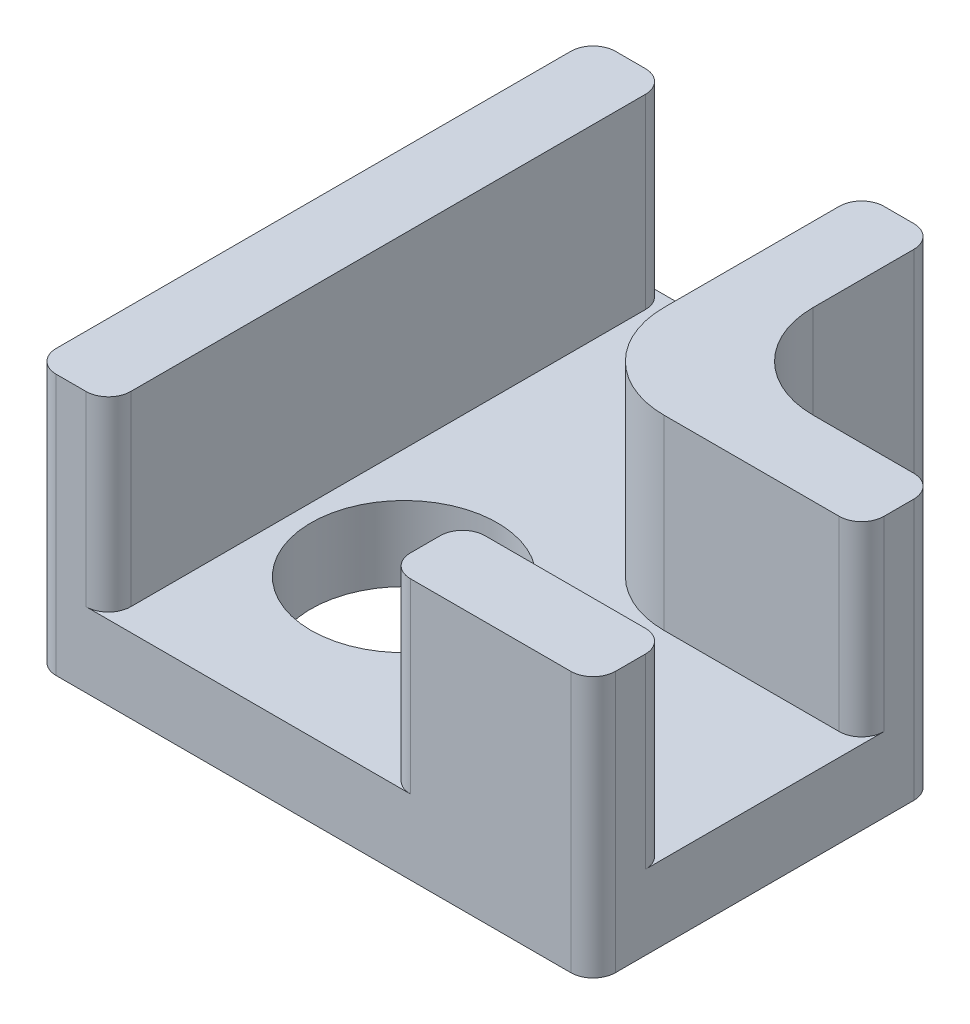
ISO-10303-21;
HEADER;
FILE_DESCRIPTION(('STEP AP214'),'2;1');
FILE_NAME('part.step','',(''),(''),'','','');
FILE_SCHEMA(('AUTOMOTIVE_DESIGN { 1 0 10303 214 1 1 1 1 }'));
ENDSEC;
DATA;
#1=APPLICATION_CONTEXT('core data for automotive mechanical design processes');
#2=APPLICATION_PROTOCOL_DEFINITION('international standard','automotive_design',2000,#1);
#3=PRODUCT_CONTEXT('',#1,'mechanical');
#4=PRODUCT('Part','Part','',(#3));
#5=PRODUCT_RELATED_PRODUCT_CATEGORY('part','',(#4));
#6=PRODUCT_DEFINITION_FORMATION('','',#4);
#7=PRODUCT_DEFINITION_CONTEXT('part definition',#1,'design');
#8=PRODUCT_DEFINITION('design','',#6,#7);
#9=PRODUCT_DEFINITION_SHAPE('','',#8);
#10=(LENGTH_UNIT() NAMED_UNIT(*) SI_UNIT(.MILLI.,.METRE.));
#11=(NAMED_UNIT(*) PLANE_ANGLE_UNIT() SI_UNIT($,.RADIAN.));
#12=(NAMED_UNIT(*) SI_UNIT($,.STERADIAN.) SOLID_ANGLE_UNIT());
#13=UNCERTAINTY_MEASURE_WITH_UNIT(LENGTH_MEASURE(1.E-05),#10,'distance_accuracy_value','');
#14=(GEOMETRIC_REPRESENTATION_CONTEXT(3) GLOBAL_UNCERTAINTY_ASSIGNED_CONTEXT((#13)) GLOBAL_UNIT_ASSIGNED_CONTEXT((#10,
#11,#12)) REPRESENTATION_CONTEXT('',''));
#15=CARTESIAN_POINT('',(0.,0.,0.));
#16=DIRECTION('',(0.,0.,1.));
#17=DIRECTION('',(1.,0.,0.));
#18=AXIS2_PLACEMENT_3D('',#15,#16,#17);
#19=CARTESIAN_POINT('',(30.,30.9,0.));
#20=DIRECTION('',(-1.,0.,0.));
#21=DIRECTION('',(0.,0.,1.));
#22=AXIS2_PLACEMENT_3D('',#19,#20,#21);
#23=PLANE('',#22);
#24=DIRECTION('',(0.,0.,-1.));
#25=VECTOR('',#24,1.);
#26=CARTESIAN_POINT('',(30.,0.,0.));
#27=LINE('',#26,#25);
#28=CARTESIAN_POINT('',(30.,0.,-1.2));
#29=VERTEX_POINT('',#28);
#30=CARTESIAN_POINT('',(30.,0.,-17.2));
#31=VERTEX_POINT('',#30);
#32=EDGE_CURVE('E433',#29,#31,#27,.T.);
#33=ORIENTED_EDGE('',*,*,#32,.T.);
#34=DIRECTION('',(0.,-1.,0.));
#35=VECTOR('',#34,1.);
#36=CARTESIAN_POINT('',(30.,30.9,-17.2));
#37=LINE('',#36,#35);
#38=CARTESIAN_POINT('',(30.,14.,-17.2));
#39=VERTEX_POINT('',#38);
#40=EDGE_CURVE('E336',#31,#39,#37,.F.);
#41=ORIENTED_EDGE('',*,*,#40,.T.);
#42=DIRECTION('',(0.,0.,1.));
#43=VECTOR('',#42,1.);
#44=CARTESIAN_POINT('',(30.,14.,0.));
#45=LINE('',#44,#43);
#46=CARTESIAN_POINT('',(30.,14.,-15.6));
#47=VERTEX_POINT('',#46);
#48=EDGE_CURVE('E476',#39,#47,#45,.T.);
#49=ORIENTED_EDGE('',*,*,#48,.T.);
#50=DIRECTION('',(0.,-1.,0.));
#51=VECTOR('',#50,1.);
#52=CARTESIAN_POINT('',(30.,4.,-15.6));
#53=LINE('',#52,#51);
#54=CARTESIAN_POINT('',(30.,4.,-15.6));
#55=VERTEX_POINT('',#54);
#56=EDGE_CURVE('E330',#47,#55,#53,.T.);
#57=ORIENTED_EDGE('',*,*,#56,.T.);
#58=DIRECTION('',(0.,0.,-1.));
#59=VECTOR('',#58,1.);
#60=CARTESIAN_POINT('',(30.,4.,0.));
#61=LINE('',#60,#59);
#62=CARTESIAN_POINT('',(30.,4.,-2.8));
#63=VERTEX_POINT('',#62);
#64=EDGE_CURVE('E421',#63,#55,#61,.T.);
#65=ORIENTED_EDGE('',*,*,#64,.F.);
#66=DIRECTION('',(0.,-1.,0.));
#67=VECTOR('',#66,1.);
#68=CARTESIAN_POINT('',(30.,14.,-2.8));
#69=LINE('',#68,#67);
#70=CARTESIAN_POINT('',(30.,14.,-2.8));
#71=VERTEX_POINT('',#70);
#72=EDGE_CURVE('E328',#63,#71,#69,.F.);
#73=ORIENTED_EDGE('',*,*,#72,.T.);
#74=CARTESIAN_POINT('',(30.,14.,-1.2));
#75=VERTEX_POINT('',#74);
#76=EDGE_CURVE('E469',#71,#75,#45,.T.);
#77=ORIENTED_EDGE('',*,*,#76,.T.);
#78=DIRECTION('',(0.,-1.,0.));
#79=VECTOR('',#78,1.);
#80=CARTESIAN_POINT('',(30.,30.9,-1.2));
#81=LINE('',#80,#79);
#82=EDGE_CURVE('E333',#75,#29,#81,.T.);
#83=ORIENTED_EDGE('',*,*,#82,.T.);
#84=EDGE_LOOP('',(#33,#41,#49,#57,#65,#73,#77,#83));
#85=FACE_BOUND('',#84,.T.);
#86=ADVANCED_FACE('F42',(#85),#23,.F.);
#87=CARTESIAN_POINT('',(18.4,30.9,-30.));
#88=DIRECTION('',(0.,0.,1.));
#89=DIRECTION('',(1.,0.,0.));
#90=AXIS2_PLACEMENT_3D('',#87,#88,#89);
#91=PLANE('',#90);
#92=DIRECTION('',(-1.,0.,0.));
#93=VECTOR('',#92,1.);
#94=CARTESIAN_POINT('',(18.4,0.,-30.));
#95=LINE('',#94,#93);
#96=CARTESIAN_POINT('',(17.2,0.,-30.));
#97=VERTEX_POINT('',#96);
#98=CARTESIAN_POINT('',(1.2,0.,-30.));
#99=VERTEX_POINT('',#98);
#100=EDGE_CURVE('E260',#97,#99,#95,.T.);
#101=ORIENTED_EDGE('',*,*,#100,.T.);
#102=DIRECTION('',(0.,-1.,0.));
#103=VECTOR('',#102,1.);
#104=CARTESIAN_POINT('',(1.2,30.9,-30.));
#105=LINE('',#104,#103);
#106=CARTESIAN_POINT('',(1.2,14.,-30.));
#107=VERTEX_POINT('',#106);
#108=EDGE_CURVE('E314',#99,#107,#105,.F.);
#109=ORIENTED_EDGE('',*,*,#108,.T.);
#110=DIRECTION('',(1.,0.,0.));
#111=VECTOR('',#110,1.);
#112=CARTESIAN_POINT('',(18.4,14.,-30.));
#113=LINE('',#112,#111);
#114=CARTESIAN_POINT('',(2.8,14.,-30.));
#115=VERTEX_POINT('',#114);
#116=EDGE_CURVE('E392',#107,#115,#113,.T.);
#117=ORIENTED_EDGE('',*,*,#116,.T.);
#118=DIRECTION('',(0.,-1.,0.));
#119=VECTOR('',#118,1.);
#120=CARTESIAN_POINT('',(2.8,4.,-30.));
#121=LINE('',#120,#119);
#122=CARTESIAN_POINT('',(2.8,4.,-30.));
#123=VERTEX_POINT('',#122);
#124=EDGE_CURVE('E308',#115,#123,#121,.T.);
#125=ORIENTED_EDGE('',*,*,#124,.T.);
#126=DIRECTION('',(-1.,0.,0.));
#127=VECTOR('',#126,1.);
#128=CARTESIAN_POINT('',(18.4,4.,-30.));
#129=LINE('',#128,#127);
#130=CARTESIAN_POINT('',(15.6,4.,-30.));
#131=VERTEX_POINT('',#130);
#132=EDGE_CURVE('E378',#131,#123,#129,.T.);
#133=ORIENTED_EDGE('',*,*,#132,.F.);
#134=DIRECTION('',(0.,-1.,0.));
#135=VECTOR('',#134,1.);
#136=CARTESIAN_POINT('',(15.6,14.,-30.));
#137=LINE('',#136,#135);
#138=CARTESIAN_POINT('',(15.6,14.,-30.));
#139=VERTEX_POINT('',#138);
#140=EDGE_CURVE('E306',#131,#139,#137,.F.);
#141=ORIENTED_EDGE('',*,*,#140,.T.);
#142=CARTESIAN_POINT('',(17.2,14.,-30.));
#143=VERTEX_POINT('',#142);
#144=EDGE_CURVE('E239',#139,#143,#113,.T.);
#145=ORIENTED_EDGE('',*,*,#144,.T.);
#146=DIRECTION('',(0.,-1.,0.));
#147=VECTOR('',#146,1.);
#148=CARTESIAN_POINT('',(17.2,30.9,-30.));
#149=LINE('',#148,#147);
#150=EDGE_CURVE('E311',#143,#97,#149,.T.);
#151=ORIENTED_EDGE('',*,*,#150,.T.);
#152=EDGE_LOOP('',(#101,#109,#117,#125,#133,#141,#145,#151));
#153=FACE_BOUND('',#152,.T.);
#154=ADVANCED_FACE('F388',(#153),#91,.F.);
#155=CARTESIAN_POINT('',(0.,30.9,-30.));
#156=DIRECTION('',(1.,0.,0.));
#157=DIRECTION('',(0.,0.,-1.));
#158=AXIS2_PLACEMENT_3D('',#155,#156,#157);
#159=PLANE('',#158);
#160=DIRECTION('',(0.,0.,1.));
#161=VECTOR('',#160,1.);
#162=CARTESIAN_POINT('',(0.,0.,-30.));
#163=LINE('',#162,#161);
#164=CARTESIAN_POINT('',(0.,0.,-28.8));
#165=VERTEX_POINT('',#164);
#166=CARTESIAN_POINT('',(0.,0.,-1.2));
#167=VERTEX_POINT('',#166);
#168=EDGE_CURVE('E426',#165,#167,#163,.T.);
#169=ORIENTED_EDGE('',*,*,#168,.T.);
#170=DIRECTION('',(0.,-1.,0.));
#171=VECTOR('',#170,1.);
#172=CARTESIAN_POINT('',(0.,30.9,-1.2));
#173=LINE('',#172,#171);
#174=CARTESIAN_POINT('',(0.,14.,-1.2));
#175=VERTEX_POINT('',#174);
#176=EDGE_CURVE('E296',#167,#175,#173,.F.);
#177=ORIENTED_EDGE('',*,*,#176,.T.);
#178=DIRECTION('',(0.,0.,-1.));
#179=VECTOR('',#178,1.);
#180=CARTESIAN_POINT('',(0.,14.,-30.));
#181=LINE('',#180,#179);
#182=CARTESIAN_POINT('',(0.,14.,-28.8));
#183=VERTEX_POINT('',#182);
#184=EDGE_CURVE('E395',#175,#183,#181,.T.);
#185=ORIENTED_EDGE('',*,*,#184,.T.);
#186=DIRECTION('',(0.,-1.,0.));
#187=VECTOR('',#186,1.);
#188=CARTESIAN_POINT('',(0.,30.9,-28.8));
#189=LINE('',#188,#187);
#190=EDGE_CURVE('E293',#183,#165,#189,.T.);
#191=ORIENTED_EDGE('',*,*,#190,.T.);
#192=EDGE_LOOP('',(#169,#177,#185,#191));
#193=FACE_BOUND('',#192,.T.);
#194=ADVANCED_FACE('F452',(#193),#159,.F.);
#195=CARTESIAN_POINT('',(0.,30.9,0.));
#196=DIRECTION('',(0.,0.,-1.));
#197=DIRECTION('',(-1.,0.,0.));
#198=AXIS2_PLACEMENT_3D('',#195,#196,#197);
#199=PLANE('',#198);
#200=DIRECTION('',(-1.,0.,0.));
#201=VECTOR('',#200,1.);
#202=CARTESIAN_POINT('',(0.,14.,0.));
#203=LINE('',#202,#201);
#204=CARTESIAN_POINT('',(2.8,14.,0.));
#205=VERTEX_POINT('',#204);
#206=CARTESIAN_POINT('',(1.2,14.,0.));
#207=VERTEX_POINT('',#206);
#208=EDGE_CURVE('E460',#205,#207,#203,.T.);
#209=ORIENTED_EDGE('',*,*,#208,.T.);
#210=DIRECTION('',(0.,-1.,0.));
#211=VECTOR('',#210,1.);
#212=CARTESIAN_POINT('',(1.2,30.9,0.));
#213=LINE('',#212,#211);
#214=CARTESIAN_POINT('',(1.2,0.,0.));
#215=VERTEX_POINT('',#214);
#216=EDGE_CURVE('E280',#207,#215,#213,.T.);
#217=ORIENTED_EDGE('',*,*,#216,.T.);
#218=DIRECTION('',(1.,0.,0.));
#219=VECTOR('',#218,1.);
#220=CARTESIAN_POINT('',(0.,0.,0.));
#221=LINE('',#220,#219);
#222=CARTESIAN_POINT('',(28.8,0.,0.));
#223=VERTEX_POINT('',#222);
#224=EDGE_CURVE('E430',#215,#223,#221,.T.);
#225=ORIENTED_EDGE('',*,*,#224,.T.);
#226=DIRECTION('',(0.,-1.,0.));
#227=VECTOR('',#226,1.);
#228=CARTESIAN_POINT('',(28.8,30.9,0.));
#229=LINE('',#228,#227);
#230=CARTESIAN_POINT('',(28.8,14.,0.));
#231=VERTEX_POINT('',#230);
#232=EDGE_CURVE('E278',#223,#231,#229,.F.);
#233=ORIENTED_EDGE('',*,*,#232,.T.);
#234=CARTESIAN_POINT('',(20.2,14.,0.));
#235=VERTEX_POINT('',#234);
#236=EDGE_CURVE('E465',#231,#235,#203,.T.);
#237=ORIENTED_EDGE('',*,*,#236,.T.);
#238=DIRECTION('',(0.,1.,0.));
#239=VECTOR('',#238,1.);
#240=CARTESIAN_POINT('',(20.2,30.9,0.));
#241=LINE('',#240,#239);
#242=CARTESIAN_POINT('',(20.2,4.,0.));
#243=VERTEX_POINT('',#242);
#244=EDGE_CURVE('E275',#235,#243,#241,.F.);
#245=ORIENTED_EDGE('',*,*,#244,.T.);
#246=DIRECTION('',(1.,0.,0.));
#247=VECTOR('',#246,1.);
#248=CARTESIAN_POINT('',(4.,4.,0.));
#249=LINE('',#248,#247);
#250=CARTESIAN_POINT('',(2.8,4.,0.));
#251=VERTEX_POINT('',#250);
#252=EDGE_CURVE('E411',#251,#243,#249,.T.);
#253=ORIENTED_EDGE('',*,*,#252,.F.);
#254=DIRECTION('',(0.,-1.,0.));
#255=VECTOR('',#254,1.);
#256=CARTESIAN_POINT('',(2.8,14.,0.));
#257=LINE('',#256,#255);
#258=EDGE_CURVE('E273',#251,#205,#257,.F.);
#259=ORIENTED_EDGE('',*,*,#258,.T.);
#260=EDGE_LOOP('',(#209,#217,#225,#233,#237,#245,#253,#259));
#261=FACE_BOUND('',#260,.T.);
#262=ADVANCED_FACE('F463',(#261),#199,.F.);
#263=CARTESIAN_POINT('',(30.,30.9,-18.4));
#264=DIRECTION('',(0.,0.,1.));
#265=DIRECTION('',(1.,0.,0.));
#266=AXIS2_PLACEMENT_3D('',#263,#264,#265);
#267=PLANE('',#266);
#268=DIRECTION('',(1.,0.,0.));
#269=VECTOR('',#268,1.);
#270=CARTESIAN_POINT('',(30.,14.,-18.4));
#271=LINE('',#270,#269);
#272=CARTESIAN_POINT('',(23.4,14.,-18.4));
#273=VERTEX_POINT('',#272);
#274=CARTESIAN_POINT('',(28.8,14.,-18.4));
#275=VERTEX_POINT('',#274);
#276=EDGE_CURVE('E240',#273,#275,#271,.T.);
#277=ORIENTED_EDGE('',*,*,#276,.T.);
#278=DIRECTION('',(0.,-1.,0.));
#279=VECTOR('',#278,1.);
#280=CARTESIAN_POINT('',(28.8,30.9,-18.4));
#281=LINE('',#280,#279);
#282=CARTESIAN_POINT('',(28.8,0.,-18.4));
#283=VERTEX_POINT('',#282);
#284=EDGE_CURVE('E325',#275,#283,#281,.T.);
#285=ORIENTED_EDGE('',*,*,#284,.T.);
#286=DIRECTION('',(-1.,0.,0.));
#287=VECTOR('',#286,1.);
#288=CARTESIAN_POINT('',(30.,0.,-18.4));
#289=LINE('',#288,#287);
#290=CARTESIAN_POINT('',(23.4,0.,-18.4));
#291=VERTEX_POINT('',#290);
#292=EDGE_CURVE('E436',#283,#291,#289,.T.);
#293=ORIENTED_EDGE('',*,*,#292,.T.);
#294=DIRECTION('',(0.,-1.,0.));
#295=VECTOR('',#294,1.);
#296=CARTESIAN_POINT('',(23.4,14.,-18.4));
#297=LINE('',#296,#295);
#298=EDGE_CURVE('E254',#291,#273,#297,.F.);
#299=ORIENTED_EDGE('',*,*,#298,.T.);
#300=EDGE_LOOP('',(#277,#285,#293,#299));
#301=FACE_BOUND('',#300,.T.);
#302=ADVANCED_FACE('F523',(#301),#267,.F.);
#303=CARTESIAN_POINT('',(18.4,30.9,-18.4));
#304=DIRECTION('',(-1.,0.,0.));
#305=DIRECTION('',(0.,0.,1.));
#306=AXIS2_PLACEMENT_3D('',#303,#304,#305);
#307=PLANE('',#306);
#308=DIRECTION('',(0.,0.,-1.));
#309=VECTOR('',#308,1.);
#310=CARTESIAN_POINT('',(18.4,0.,-18.4));
#311=LINE('',#310,#309);
#312=CARTESIAN_POINT('',(18.4,0.,-23.4));
#313=VERTEX_POINT('',#312);
#314=CARTESIAN_POINT('',(18.4,0.,-28.8));
#315=VERTEX_POINT('',#314);
#316=EDGE_CURVE('E438',#313,#315,#311,.T.);
#317=ORIENTED_EDGE('',*,*,#316,.T.);
#318=DIRECTION('',(0.,-1.,0.));
#319=VECTOR('',#318,1.);
#320=CARTESIAN_POINT('',(18.4,30.9,-28.8));
#321=LINE('',#320,#319);
#322=CARTESIAN_POINT('',(18.4,14.,-28.8));
#323=VERTEX_POINT('',#322);
#324=EDGE_CURVE('E236',#315,#323,#321,.F.);
#325=ORIENTED_EDGE('',*,*,#324,.T.);
#326=DIRECTION('',(0.,0.,1.));
#327=VECTOR('',#326,1.);
#328=CARTESIAN_POINT('',(18.4,14.,-18.4));
#329=LINE('',#328,#327);
#330=CARTESIAN_POINT('',(18.4,14.,-23.4));
#331=VERTEX_POINT('',#330);
#332=EDGE_CURVE('E228',#323,#331,#329,.T.);
#333=ORIENTED_EDGE('',*,*,#332,.T.);
#334=DIRECTION('',(0.,-1.,0.));
#335=VECTOR('',#334,1.);
#336=CARTESIAN_POINT('',(18.4,0.,-23.4));
#337=LINE('',#336,#335);
#338=EDGE_CURVE('E233',#331,#313,#337,.T.);
#339=ORIENTED_EDGE('',*,*,#338,.T.);
#340=EDGE_LOOP('',(#317,#325,#333,#339));
#341=FACE_BOUND('',#340,.T.);
#342=ADVANCED_FACE('F231',(#341),#307,.F.);
#343=CARTESIAN_POINT('',(4.,30.9,-30.));
#344=DIRECTION('',(1.,0.,0.));
#345=DIRECTION('',(0.,0.,-1.));
#346=AXIS2_PLACEMENT_3D('',#343,#344,#345);
#347=PLANE('',#346);
#348=DIRECTION('',(0.,0.,1.));
#349=VECTOR('',#348,1.);
#350=CARTESIAN_POINT('',(4.,4.,-30.));
#351=LINE('',#350,#349);
#352=CARTESIAN_POINT('',(4.,4.,-28.8));
#353=VERTEX_POINT('',#352);
#354=CARTESIAN_POINT('',(4.,4.,-1.2));
#355=VERTEX_POINT('',#354);
#356=EDGE_CURVE('E413',#353,#355,#351,.T.);
#357=ORIENTED_EDGE('',*,*,#356,.F.);
#358=DIRECTION('',(0.,-1.,0.));
#359=VECTOR('',#358,1.);
#360=CARTESIAN_POINT('',(4.,14.,-28.8));
#361=LINE('',#360,#359);
#362=CARTESIAN_POINT('',(4.,14.,-28.8));
#363=VERTEX_POINT('',#362);
#364=EDGE_CURVE('E361',#353,#363,#361,.F.);
#365=ORIENTED_EDGE('',*,*,#364,.T.);
#366=DIRECTION('',(0.,0.,1.));
#367=VECTOR('',#366,1.);
#368=CARTESIAN_POINT('',(4.,14.,-30.));
#369=LINE('',#368,#367);
#370=CARTESIAN_POINT('',(4.,14.,-1.2));
#371=VERTEX_POINT('',#370);
#372=EDGE_CURVE('E407',#363,#371,#369,.T.);
#373=ORIENTED_EDGE('',*,*,#372,.T.);
#374=DIRECTION('',(0.,-1.,0.));
#375=VECTOR('',#374,1.);
#376=CARTESIAN_POINT('',(4.,4.,-1.2));
#377=LINE('',#376,#375);
#378=EDGE_CURVE('E359',#371,#355,#377,.T.);
#379=ORIENTED_EDGE('',*,*,#378,.T.);
#380=EDGE_LOOP('',(#357,#365,#373,#379));
#381=FACE_BOUND('',#380,.T.);
#382=ADVANCED_FACE('F580',(#381),#347,.T.);
#383=CARTESIAN_POINT('',(0.,30.9,-4.));
#384=DIRECTION('',(0.,0.,-1.));
#385=DIRECTION('',(-1.,0.,0.));
#386=AXIS2_PLACEMENT_3D('',#383,#384,#385);
#387=PLANE('',#386);
#388=DIRECTION('',(1.,0.,0.));
#389=VECTOR('',#388,1.);
#390=CARTESIAN_POINT('',(0.,14.,-4.));
#391=LINE('',#390,#389);
#392=CARTESIAN_POINT('',(20.2,14.,-4.));
#393=VERTEX_POINT('',#392);
#394=CARTESIAN_POINT('',(28.8,14.,-4.));
#395=VERTEX_POINT('',#394);
#396=EDGE_CURVE('E400',#393,#395,#391,.T.);
#397=ORIENTED_EDGE('',*,*,#396,.T.);
#398=DIRECTION('',(0.,-1.,0.));
#399=VECTOR('',#398,1.);
#400=CARTESIAN_POINT('',(28.8,4.,-4.));
#401=LINE('',#400,#399);
#402=CARTESIAN_POINT('',(28.8,4.,-4.));
#403=VERTEX_POINT('',#402);
#404=EDGE_CURVE('E351',#395,#403,#401,.T.);
#405=ORIENTED_EDGE('',*,*,#404,.T.);
#406=DIRECTION('',(1.,0.,0.));
#407=VECTOR('',#406,1.);
#408=CARTESIAN_POINT('',(0.,4.,-4.));
#409=LINE('',#408,#407);
#410=CARTESIAN_POINT('',(20.2,4.,-4.));
#411=VERTEX_POINT('',#410);
#412=EDGE_CURVE('E418',#411,#403,#409,.T.);
#413=ORIENTED_EDGE('',*,*,#412,.F.);
#414=DIRECTION('',(0.,1.,0.));
#415=VECTOR('',#414,1.);
#416=CARTESIAN_POINT('',(20.2,14.,-4.));
#417=LINE('',#416,#415);
#418=EDGE_CURVE('E348',#411,#393,#417,.T.);
#419=ORIENTED_EDGE('',*,*,#418,.T.);
#420=EDGE_LOOP('',(#397,#405,#413,#419));
#421=FACE_BOUND('',#420,.T.);
#422=ADVANCED_FACE('F512',(#421),#387,.T.);
#423=CARTESIAN_POINT('',(30.,30.9,-14.4));
#424=DIRECTION('',(0.,0.,1.));
#425=DIRECTION('',(1.,0.,0.));
#426=AXIS2_PLACEMENT_3D('',#423,#424,#425);
#427=PLANE('',#426);
#428=DIRECTION('',(-1.,0.,0.));
#429=VECTOR('',#428,1.);
#430=CARTESIAN_POINT('',(30.,4.,-14.4));
#431=LINE('',#430,#429);
#432=CARTESIAN_POINT('',(28.8,4.,-14.4));
#433=VERTEX_POINT('',#432);
#434=CARTESIAN_POINT('',(19.4,4.,-14.4));
#435=VERTEX_POINT('',#434);
#436=EDGE_CURVE('E422',#433,#435,#431,.T.);
#437=ORIENTED_EDGE('',*,*,#436,.F.);
#438=DIRECTION('',(0.,-1.,0.));
#439=VECTOR('',#438,1.);
#440=CARTESIAN_POINT('',(28.8,14.,-14.4));
#441=LINE('',#440,#439);
#442=CARTESIAN_POINT('',(28.8,14.,-14.4));
#443=VERTEX_POINT('',#442);
#444=EDGE_CURVE('E346',#433,#443,#441,.F.);
#445=ORIENTED_EDGE('',*,*,#444,.T.);
#446=DIRECTION('',(-1.,0.,0.));
#447=VECTOR('',#446,1.);
#448=CARTESIAN_POINT('',(30.,14.,-14.4));
#449=LINE('',#448,#447);
#450=CARTESIAN_POINT('',(19.4,14.,-14.4));
#451=VERTEX_POINT('',#450);
#452=EDGE_CURVE('E405',#443,#451,#449,.T.);
#453=ORIENTED_EDGE('',*,*,#452,.T.);
#454=DIRECTION('',(0.,-1.,0.));
#455=VECTOR('',#454,1.);
#456=CARTESIAN_POINT('',(19.4,30.9,-14.4));
#457=LINE('',#456,#455);
#458=EDGE_CURVE('E257',#451,#435,#457,.T.);
#459=ORIENTED_EDGE('',*,*,#458,.T.);
#460=EDGE_LOOP('',(#437,#445,#453,#459));
#461=FACE_BOUND('',#460,.T.);
#462=ADVANCED_FACE('F493',(#461),#427,.T.);
#463=CARTESIAN_POINT('',(14.4,30.9,-18.4));
#464=DIRECTION('',(-1.,0.,0.));
#465=DIRECTION('',(0.,0.,1.));
#466=AXIS2_PLACEMENT_3D('',#463,#464,#465);
#467=PLANE('',#466);
#468=DIRECTION('',(0.,0.,-1.));
#469=VECTOR('',#468,1.);
#470=CARTESIAN_POINT('',(14.4,14.,-18.4));
#471=LINE('',#470,#469);
#472=CARTESIAN_POINT('',(14.4,14.,-19.4));
#473=VERTEX_POINT('',#472);
#474=CARTESIAN_POINT('',(14.4,14.,-28.8));
#475=VERTEX_POINT('',#474);
#476=EDGE_CURVE('E403',#473,#475,#471,.T.);
#477=ORIENTED_EDGE('',*,*,#476,.T.);
#478=DIRECTION('',(0.,-1.,0.));
#479=VECTOR('',#478,1.);
#480=CARTESIAN_POINT('',(14.4,4.,-28.8));
#481=LINE('',#480,#479);
#482=CARTESIAN_POINT('',(14.4,4.,-28.8));
#483=VERTEX_POINT('',#482);
#484=EDGE_CURVE('E363',#475,#483,#481,.T.);
#485=ORIENTED_EDGE('',*,*,#484,.T.);
#486=DIRECTION('',(0.,0.,-1.));
#487=VECTOR('',#486,1.);
#488=CARTESIAN_POINT('',(14.4,4.,-18.4));
#489=LINE('',#488,#487);
#490=CARTESIAN_POINT('',(14.4,4.,-19.4));
#491=VERTEX_POINT('',#490);
#492=EDGE_CURVE('E381',#491,#483,#489,.T.);
#493=ORIENTED_EDGE('',*,*,#492,.F.);
#494=DIRECTION('',(0.,-1.,0.));
#495=VECTOR('',#494,1.);
#496=CARTESIAN_POINT('',(14.4,30.9,-19.4));
#497=LINE('',#496,#495);
#498=EDGE_CURVE('E266',#491,#473,#497,.F.);
#499=ORIENTED_EDGE('',*,*,#498,.T.);
#500=EDGE_LOOP('',(#477,#485,#493,#499));
#501=FACE_BOUND('',#500,.T.);
#502=ADVANCED_FACE('F501',(#501),#467,.T.);
#503=CARTESIAN_POINT('',(19.,26.9,-30.001));
#504=DIRECTION('',(1.,0.,0.));
#505=DIRECTION('',(0.,1.,0.));
#506=AXIS2_PLACEMENT_3D('',#503,#504,#505);
#507=PLANE('',#506);
#508=DIRECTION('',(0.,0.,1.));
#509=VECTOR('',#508,1.);
#510=CARTESIAN_POINT('',(19.,14.,-30.001));
#511=LINE('',#510,#509);
#512=CARTESIAN_POINT('',(19.,14.,-2.8));
#513=VERTEX_POINT('',#512);
#514=CARTESIAN_POINT('',(19.,14.,-1.2));
#515=VERTEX_POINT('',#514);
#516=EDGE_CURVE('E255',#513,#515,#511,.T.);
#517=ORIENTED_EDGE('',*,*,#516,.F.);
#518=DIRECTION('',(0.,1.,0.));
#519=VECTOR('',#518,1.);
#520=CARTESIAN_POINT('',(19.,4.,-2.8));
#521=LINE('',#520,#519);
#522=CARTESIAN_POINT('',(19.,4.,-2.8));
#523=VERTEX_POINT('',#522);
#524=EDGE_CURVE('E357',#513,#523,#521,.F.);
#525=ORIENTED_EDGE('',*,*,#524,.T.);
#526=DIRECTION('',(0.,0.,1.));
#527=VECTOR('',#526,1.);
#528=CARTESIAN_POINT('',(19.,4.,-30.001));
#529=LINE('',#528,#527);
#530=CARTESIAN_POINT('',(19.,4.,-1.2));
#531=VERTEX_POINT('',#530);
#532=EDGE_CURVE('E410',#523,#531,#529,.T.);
#533=ORIENTED_EDGE('',*,*,#532,.T.);
#534=DIRECTION('',(0.,1.,0.));
#535=VECTOR('',#534,1.);
#536=CARTESIAN_POINT('',(19.,26.9,-1.2));
#537=LINE('',#536,#535);
#538=EDGE_CURVE('E354',#531,#515,#537,.T.);
#539=ORIENTED_EDGE('',*,*,#538,.T.);
#540=EDGE_LOOP('',(#517,#525,#533,#539));
#541=FACE_BOUND('',#540,.T.);
#542=ADVANCED_FACE('F503',(#541),#507,.F.);
#543=CARTESIAN_POINT('',(0.,0.,0.));
#544=DIRECTION('',(0.,1.,0.));
#545=DIRECTION('',(0.,0.,1.));
#546=AXIS2_PLACEMENT_3D('',#543,#544,#545);
#547=PLANE('',#546);
#548=CARTESIAN_POINT('',(9.93223304703363,0.,-9.93223304703363));
#549=DIRECTION('',(0.,1.,0.));
#550=DIRECTION('',(0.,0.,1.));
#551=AXIS2_PLACEMENT_3D('',#548,#549,#550);
#552=CIRCLE('',#551,5.);
#553=CARTESIAN_POINT('',(9.93223304703363,0.,-4.93223304703363));
#554=VERTEX_POINT('',#553);
#555=EDGE_CURVE('E466',#554,#554,#552,.T.);
#556=ORIENTED_EDGE('',*,*,#555,.T.);
#557=EDGE_LOOP('',(#556));
#558=FACE_BOUND('',#557,.T.);
#559=ORIENTED_EDGE('',*,*,#224,.F.);
#560=CARTESIAN_POINT('',(1.2,0.,-1.2));
#561=DIRECTION('',(0.,1.,0.));
#562=DIRECTION('',(0.,0.,1.));
#563=AXIS2_PLACEMENT_3D('',#560,#561,#562);
#564=CIRCLE('',#563,1.2);
#565=EDGE_CURVE('E291',#215,#167,#564,.F.);
#566=ORIENTED_EDGE('',*,*,#565,.T.);
#567=ORIENTED_EDGE('',*,*,#168,.F.);
#568=CARTESIAN_POINT('',(1.2,0.,-28.8));
#569=DIRECTION('',(0.,1.,0.));
#570=DIRECTION('',(0.,0.,1.));
#571=AXIS2_PLACEMENT_3D('',#568,#569,#570);
#572=CIRCLE('',#571,1.2);
#573=EDGE_CURVE('E289',#165,#99,#572,.F.);
#574=ORIENTED_EDGE('',*,*,#573,.T.);
#575=ORIENTED_EDGE('',*,*,#100,.F.);
#576=CARTESIAN_POINT('',(17.2,0.,-28.8));
#577=DIRECTION('',(0.,1.,0.));
#578=DIRECTION('',(0.,0.,1.));
#579=AXIS2_PLACEMENT_3D('',#576,#577,#578);
#580=CIRCLE('',#579,1.2);
#581=EDGE_CURVE('E287',#97,#315,#580,.F.);
#582=ORIENTED_EDGE('',*,*,#581,.T.);
#583=ORIENTED_EDGE('',*,*,#316,.F.);
#584=CARTESIAN_POINT('',(23.4,0.,-23.4));
#585=DIRECTION('',(0.,1.,0.));
#586=DIRECTION('',(0.,0.,1.));
#587=AXIS2_PLACEMENT_3D('',#584,#585,#586);
#588=CIRCLE('',#587,5.);
#589=EDGE_CURVE('E250',#313,#291,#588,.T.);
#590=ORIENTED_EDGE('',*,*,#589,.T.);
#591=ORIENTED_EDGE('',*,*,#292,.F.);
#592=CARTESIAN_POINT('',(28.8,0.,-17.2));
#593=DIRECTION('',(0.,1.,0.));
#594=DIRECTION('',(0.,0.,1.));
#595=AXIS2_PLACEMENT_3D('',#592,#593,#594);
#596=CIRCLE('',#595,1.2);
#597=EDGE_CURVE('E285',#283,#31,#596,.F.);
#598=ORIENTED_EDGE('',*,*,#597,.T.);
#599=ORIENTED_EDGE('',*,*,#32,.F.);
#600=CARTESIAN_POINT('',(28.8,0.,-1.2));
#601=DIRECTION('',(0.,1.,0.));
#602=DIRECTION('',(0.,0.,1.));
#603=AXIS2_PLACEMENT_3D('',#600,#601,#602);
#604=CIRCLE('',#603,1.2);
#605=EDGE_CURVE('E283',#29,#223,#604,.F.);
#606=ORIENTED_EDGE('',*,*,#605,.T.);
#607=EDGE_LOOP('',(#559,#566,#567,#574,#575,#582,#583,#590,#591,#598,#599,#606));
#608=FACE_BOUND('',#607,.T.);
#609=ADVANCED_FACE('F509',(#558,#608),#547,.F.);
#610=CARTESIAN_POINT('',(0.,4.,0.));
#611=DIRECTION('',(0.,1.,0.));
#612=DIRECTION('',(0.,0.,1.));
#613=AXIS2_PLACEMENT_3D('',#610,#611,#612);
#614=PLANE('',#613);
#615=CARTESIAN_POINT('',(9.93223304703363,4.,-9.93223304703363));
#616=DIRECTION('',(0.,1.,0.));
#617=DIRECTION('',(0.,0.,1.));
#618=AXIS2_PLACEMENT_3D('',#615,#616,#617);
#619=CIRCLE('',#618,5.);
#620=CARTESIAN_POINT('',(9.93223304703363,4.,-4.93223304703363));
#621=VERTEX_POINT('',#620);
#622=EDGE_CURVE('E471',#621,#621,#619,.T.);
#623=ORIENTED_EDGE('',*,*,#622,.F.);
#624=EDGE_LOOP('',(#623));
#625=FACE_BOUND('',#624,.T.);
#626=ORIENTED_EDGE('',*,*,#132,.T.);
#627=CARTESIAN_POINT('',(2.8,4.,-28.8));
#628=DIRECTION('',(0.,1.,0.));
#629=DIRECTION('',(0.,0.,1.));
#630=AXIS2_PLACEMENT_3D('',#627,#628,#629);
#631=CIRCLE('',#630,1.2);
#632=EDGE_CURVE('E374',#123,#353,#631,.F.);
#633=ORIENTED_EDGE('',*,*,#632,.T.);
#634=ORIENTED_EDGE('',*,*,#356,.T.);
#635=CARTESIAN_POINT('',(2.8,4.,-1.2));
#636=DIRECTION('',(0.,1.,0.));
#637=DIRECTION('',(0.,0.,1.));
#638=AXIS2_PLACEMENT_3D('',#635,#636,#637);
#639=CIRCLE('',#638,1.2);
#640=EDGE_CURVE('E13',#355,#251,#639,.F.);
#641=ORIENTED_EDGE('',*,*,#640,.T.);
#642=ORIENTED_EDGE('',*,*,#252,.T.);
#643=CARTESIAN_POINT('',(20.2,4.,-1.2));
#644=DIRECTION('',(0.,1.,0.));
#645=DIRECTION('',(0.,0.,1.));
#646=AXIS2_PLACEMENT_3D('',#643,#644,#645);
#647=CIRCLE('',#646,1.2);
#648=EDGE_CURVE('E372',#243,#531,#647,.F.);
#649=ORIENTED_EDGE('',*,*,#648,.T.);
#650=ORIENTED_EDGE('',*,*,#532,.F.);
#651=CARTESIAN_POINT('',(20.2,4.,-2.8));
#652=DIRECTION('',(0.,1.,0.));
#653=DIRECTION('',(0.,0.,1.));
#654=AXIS2_PLACEMENT_3D('',#651,#652,#653);
#655=CIRCLE('',#654,1.2);
#656=EDGE_CURVE('E370',#523,#411,#655,.F.);
#657=ORIENTED_EDGE('',*,*,#656,.T.);
#658=ORIENTED_EDGE('',*,*,#412,.T.);
#659=CARTESIAN_POINT('',(28.8,4.,-2.8));
#660=DIRECTION('',(0.,1.,0.));
#661=DIRECTION('',(0.,0.,1.));
#662=AXIS2_PLACEMENT_3D('',#659,#660,#661);
#663=CIRCLE('',#662,1.2);
#664=EDGE_CURVE('E367',#403,#63,#663,.F.);
#665=ORIENTED_EDGE('',*,*,#664,.T.);
#666=ORIENTED_EDGE('',*,*,#64,.T.);
#667=CARTESIAN_POINT('',(28.8,4.,-15.6));
#668=DIRECTION('',(0.,1.,0.));
#669=DIRECTION('',(0.,0.,1.));
#670=AXIS2_PLACEMENT_3D('',#667,#668,#669);
#671=CIRCLE('',#670,1.2);
#672=EDGE_CURVE('E365',#55,#433,#671,.F.);
#673=ORIENTED_EDGE('',*,*,#672,.T.);
#674=ORIENTED_EDGE('',*,*,#436,.T.);
#675=CARTESIAN_POINT('',(19.4,4.,-19.4));
#676=DIRECTION('',(0.,1.,0.));
#677=DIRECTION('',(0.,0.,1.));
#678=AXIS2_PLACEMENT_3D('',#675,#676,#677);
#679=CIRCLE('',#678,5.);
#680=EDGE_CURVE('E249',#435,#491,#679,.F.);
#681=ORIENTED_EDGE('',*,*,#680,.T.);
#682=ORIENTED_EDGE('',*,*,#492,.T.);
#683=CARTESIAN_POINT('',(15.6,4.,-28.8));
#684=DIRECTION('',(0.,1.,0.));
#685=DIRECTION('',(0.,0.,1.));
#686=AXIS2_PLACEMENT_3D('',#683,#684,#685);
#687=CIRCLE('',#686,1.2);
#688=EDGE_CURVE('E50',#483,#131,#687,.F.);
#689=ORIENTED_EDGE('',*,*,#688,.T.);
#690=EDGE_LOOP('',(#626,#633,#634,#641,#642,#649,#650,#657,#658,#665,#666,#673,#674,#681,#682,#689));
#691=FACE_BOUND('',#690,.T.);
#692=ADVANCED_FACE('F377',(#625,#691),#614,.T.);
#693=CARTESIAN_POINT('',(0.,14.,0.));
#694=DIRECTION('',(0.,1.,0.));
#695=DIRECTION('',(0.,0.,1.));
#696=AXIS2_PLACEMENT_3D('',#693,#694,#695);
#697=PLANE('',#696);
#698=ORIENTED_EDGE('',*,*,#236,.F.);
#699=CARTESIAN_POINT('',(28.8,14.,-1.2));
#700=DIRECTION('',(0.,1.,0.));
#701=DIRECTION('',(0.,0.,1.));
#702=AXIS2_PLACEMENT_3D('',#699,#700,#701);
#703=CIRCLE('',#702,1.2);
#704=EDGE_CURVE('E344',#231,#75,#703,.T.);
#705=ORIENTED_EDGE('',*,*,#704,.T.);
#706=ORIENTED_EDGE('',*,*,#76,.F.);
#707=CARTESIAN_POINT('',(28.8,14.,-2.8));
#708=DIRECTION('',(0.,1.,0.));
#709=DIRECTION('',(0.,0.,1.));
#710=AXIS2_PLACEMENT_3D('',#707,#708,#709);
#711=CIRCLE('',#710,1.2);
#712=EDGE_CURVE('E342',#71,#395,#711,.T.);
#713=ORIENTED_EDGE('',*,*,#712,.T.);
#714=ORIENTED_EDGE('',*,*,#396,.F.);
#715=CARTESIAN_POINT('',(20.2,14.,-2.8));
#716=DIRECTION('',(0.,1.,0.));
#717=DIRECTION('',(0.,0.,1.));
#718=AXIS2_PLACEMENT_3D('',#715,#716,#717);
#719=CIRCLE('',#718,1.2);
#720=EDGE_CURVE('E340',#393,#513,#719,.T.);
#721=ORIENTED_EDGE('',*,*,#720,.T.);
#722=ORIENTED_EDGE('',*,*,#516,.T.);
#723=CARTESIAN_POINT('',(20.2,14.,-1.2));
#724=DIRECTION('',(0.,1.,0.));
#725=DIRECTION('',(0.,0.,1.));
#726=AXIS2_PLACEMENT_3D('',#723,#724,#725);
#727=CIRCLE('',#726,1.2);
#728=EDGE_CURVE('E338',#515,#235,#727,.T.);
#729=ORIENTED_EDGE('',*,*,#728,.T.);
#730=EDGE_LOOP('',(#698,#705,#706,#713,#714,#721,#722,#729));
#731=FACE_BOUND('',#730,.T.);
#732=ADVANCED_FACE('F591',(#731),#697,.T.);
#733=ORIENTED_EDGE('',*,*,#332,.F.);
#734=CARTESIAN_POINT('',(17.2,14.,-28.8));
#735=DIRECTION('',(0.,1.,0.));
#736=DIRECTION('',(0.,0.,1.));
#737=AXIS2_PLACEMENT_3D('',#734,#735,#736);
#738=CIRCLE('',#737,1.2);
#739=EDGE_CURVE('E323',#323,#143,#738,.T.);
#740=ORIENTED_EDGE('',*,*,#739,.T.);
#741=ORIENTED_EDGE('',*,*,#144,.F.);
#742=CARTESIAN_POINT('',(15.6,14.,-28.8));
#743=DIRECTION('',(0.,1.,0.));
#744=DIRECTION('',(0.,0.,1.));
#745=AXIS2_PLACEMENT_3D('',#742,#743,#744);
#746=CIRCLE('',#745,1.2);
#747=EDGE_CURVE('E317',#139,#475,#746,.T.);
#748=ORIENTED_EDGE('',*,*,#747,.T.);
#749=ORIENTED_EDGE('',*,*,#476,.F.);
#750=CARTESIAN_POINT('',(19.4,14.,-19.4));
#751=DIRECTION('',(0.,1.,0.));
#752=DIRECTION('',(0.,0.,1.));
#753=AXIS2_PLACEMENT_3D('',#750,#751,#752);
#754=CIRCLE('',#753,5.);
#755=EDGE_CURVE('E268',#473,#451,#754,.T.);
#756=ORIENTED_EDGE('',*,*,#755,.T.);
#757=ORIENTED_EDGE('',*,*,#452,.F.);
#758=CARTESIAN_POINT('',(28.8,14.,-15.6));
#759=DIRECTION('',(0.,1.,0.));
#760=DIRECTION('',(0.,0.,1.));
#761=AXIS2_PLACEMENT_3D('',#758,#759,#760);
#762=CIRCLE('',#761,1.2);
#763=EDGE_CURVE('E319',#443,#47,#762,.T.);
#764=ORIENTED_EDGE('',*,*,#763,.T.);
#765=ORIENTED_EDGE('',*,*,#48,.F.);
#766=CARTESIAN_POINT('',(28.8,14.,-17.2));
#767=DIRECTION('',(0.,1.,0.));
#768=DIRECTION('',(0.,0.,1.));
#769=AXIS2_PLACEMENT_3D('',#766,#767,#768);
#770=CIRCLE('',#769,1.2);
#771=EDGE_CURVE('E321',#39,#275,#770,.T.);
#772=ORIENTED_EDGE('',*,*,#771,.T.);
#773=ORIENTED_EDGE('',*,*,#276,.F.);
#774=CARTESIAN_POINT('',(23.4,14.,-23.4));
#775=DIRECTION('',(0.,1.,0.));
#776=DIRECTION('',(0.,0.,1.));
#777=AXIS2_PLACEMENT_3D('',#774,#775,#776);
#778=CIRCLE('',#777,5.);
#779=EDGE_CURVE('E244',#273,#331,#778,.F.);
#780=ORIENTED_EDGE('',*,*,#779,.T.);
#781=EDGE_LOOP('',(#733,#740,#741,#748,#749,#756,#757,#764,#765,#772,#773,#780));
#782=FACE_BOUND('',#781,.T.);
#783=ADVANCED_FACE('F245',(#782),#697,.T.);
#784=ORIENTED_EDGE('',*,*,#184,.F.);
#785=CARTESIAN_POINT('',(1.2,14.,-1.2));
#786=DIRECTION('',(0.,1.,0.));
#787=DIRECTION('',(0.,0.,1.));
#788=AXIS2_PLACEMENT_3D('',#785,#786,#787);
#789=CIRCLE('',#788,1.2);
#790=EDGE_CURVE('E304',#175,#207,#789,.T.);
#791=ORIENTED_EDGE('',*,*,#790,.T.);
#792=ORIENTED_EDGE('',*,*,#208,.F.);
#793=CARTESIAN_POINT('',(2.8,14.,-1.2));
#794=DIRECTION('',(0.,1.,0.));
#795=DIRECTION('',(0.,0.,1.));
#796=AXIS2_PLACEMENT_3D('',#793,#794,#795);
#797=CIRCLE('',#796,1.2);
#798=EDGE_CURVE('E298',#205,#371,#797,.T.);
#799=ORIENTED_EDGE('',*,*,#798,.T.);
#800=ORIENTED_EDGE('',*,*,#372,.F.);
#801=CARTESIAN_POINT('',(2.8,14.,-28.8));
#802=DIRECTION('',(0.,1.,0.));
#803=DIRECTION('',(0.,0.,1.));
#804=AXIS2_PLACEMENT_3D('',#801,#802,#803);
#805=CIRCLE('',#804,1.2);
#806=EDGE_CURVE('E300',#363,#115,#805,.T.);
#807=ORIENTED_EDGE('',*,*,#806,.T.);
#808=ORIENTED_EDGE('',*,*,#116,.F.);
#809=CARTESIAN_POINT('',(1.2,14.,-28.8));
#810=DIRECTION('',(0.,1.,0.));
#811=DIRECTION('',(0.,0.,1.));
#812=AXIS2_PLACEMENT_3D('',#809,#810,#811);
#813=CIRCLE('',#812,1.2);
#814=EDGE_CURVE('E302',#107,#183,#813,.T.);
#815=ORIENTED_EDGE('',*,*,#814,.T.);
#816=EDGE_LOOP('',(#784,#791,#792,#799,#800,#807,#808,#815));
#817=FACE_BOUND('',#816,.T.);
#818=ADVANCED_FACE('F449',(#817),#697,.T.);
#819=CARTESIAN_POINT('',(23.4,30.9,-23.4));
#820=DIRECTION('',(0.,1.,0.));
#821=DIRECTION('',(0.,0.,1.));
#822=AXIS2_PLACEMENT_3D('',#819,#820,#821);
#823=CYLINDRICAL_SURFACE('',#822,5.);
#824=ORIENTED_EDGE('',*,*,#779,.F.);
#825=ORIENTED_EDGE('',*,*,#298,.F.);
#826=ORIENTED_EDGE('',*,*,#589,.F.);
#827=ORIENTED_EDGE('',*,*,#338,.F.);
#828=EDGE_LOOP('',(#824,#825,#826,#827));
#829=FACE_BOUND('',#828,.T.);
#830=ADVANCED_FACE('F252',(#829),#823,.F.);
#831=CARTESIAN_POINT('',(19.4,30.9,-19.4));
#832=DIRECTION('',(0.,-1.,0.));
#833=DIRECTION('',(0.,0.,-1.));
#834=AXIS2_PLACEMENT_3D('',#831,#832,#833);
#835=CYLINDRICAL_SURFACE('',#834,5.);
#836=ORIENTED_EDGE('',*,*,#755,.F.);
#837=ORIENTED_EDGE('',*,*,#498,.F.);
#838=ORIENTED_EDGE('',*,*,#680,.F.);
#839=ORIENTED_EDGE('',*,*,#458,.F.);
#840=EDGE_LOOP('',(#836,#837,#838,#839));
#841=FACE_BOUND('',#840,.T.);
#842=ADVANCED_FACE('F498',(#841),#835,.T.);
#843=CARTESIAN_POINT('',(1.2,30.9,-1.2));
#844=DIRECTION('',(0.,-1.,0.));
#845=DIRECTION('',(0.,0.,-1.));
#846=AXIS2_PLACEMENT_3D('',#843,#844,#845);
#847=CYLINDRICAL_SURFACE('',#846,1.2);
#848=ORIENTED_EDGE('',*,*,#790,.F.);
#849=ORIENTED_EDGE('',*,*,#176,.F.);
#850=ORIENTED_EDGE('',*,*,#565,.F.);
#851=ORIENTED_EDGE('',*,*,#216,.F.);
#852=EDGE_LOOP('',(#848,#849,#850,#851));
#853=FACE_BOUND('',#852,.T.);
#854=ADVANCED_FACE('F456',(#853),#847,.T.);
#855=CARTESIAN_POINT('',(1.2,30.9,-28.8));
#856=DIRECTION('',(0.,-1.,0.));
#857=DIRECTION('',(0.,0.,-1.));
#858=AXIS2_PLACEMENT_3D('',#855,#856,#857);
#859=CYLINDRICAL_SURFACE('',#858,1.2);
#860=ORIENTED_EDGE('',*,*,#814,.F.);
#861=ORIENTED_EDGE('',*,*,#108,.F.);
#862=ORIENTED_EDGE('',*,*,#573,.F.);
#863=ORIENTED_EDGE('',*,*,#190,.F.);
#864=EDGE_LOOP('',(#860,#861,#862,#863));
#865=FACE_BOUND('',#864,.T.);
#866=ADVANCED_FACE('F445',(#865),#859,.T.);
#867=CARTESIAN_POINT('',(17.2,30.9,-28.8));
#868=DIRECTION('',(0.,-1.,0.));
#869=DIRECTION('',(0.,0.,-1.));
#870=AXIS2_PLACEMENT_3D('',#867,#868,#869);
#871=CYLINDRICAL_SURFACE('',#870,1.2);
#872=ORIENTED_EDGE('',*,*,#739,.F.);
#873=ORIENTED_EDGE('',*,*,#324,.F.);
#874=ORIENTED_EDGE('',*,*,#581,.F.);
#875=ORIENTED_EDGE('',*,*,#150,.F.);
#876=EDGE_LOOP('',(#872,#873,#874,#875));
#877=FACE_BOUND('',#876,.T.);
#878=ADVANCED_FACE('F537',(#877),#871,.T.);
#879=CARTESIAN_POINT('',(28.8,30.9,-17.2));
#880=DIRECTION('',(0.,-1.,0.));
#881=DIRECTION('',(0.,0.,-1.));
#882=AXIS2_PLACEMENT_3D('',#879,#880,#881);
#883=CYLINDRICAL_SURFACE('',#882,1.2);
#884=ORIENTED_EDGE('',*,*,#771,.F.);
#885=ORIENTED_EDGE('',*,*,#40,.F.);
#886=ORIENTED_EDGE('',*,*,#597,.F.);
#887=ORIENTED_EDGE('',*,*,#284,.F.);
#888=EDGE_LOOP('',(#884,#885,#886,#887));
#889=FACE_BOUND('',#888,.T.);
#890=ADVANCED_FACE('F540',(#889),#883,.T.);
#891=CARTESIAN_POINT('',(28.8,30.9,-1.2));
#892=DIRECTION('',(0.,-1.,0.));
#893=DIRECTION('',(0.,0.,-1.));
#894=AXIS2_PLACEMENT_3D('',#891,#892,#893);
#895=CYLINDRICAL_SURFACE('',#894,1.2);
#896=ORIENTED_EDGE('',*,*,#704,.F.);
#897=ORIENTED_EDGE('',*,*,#232,.F.);
#898=ORIENTED_EDGE('',*,*,#605,.F.);
#899=ORIENTED_EDGE('',*,*,#82,.F.);
#900=EDGE_LOOP('',(#896,#897,#898,#899));
#901=FACE_BOUND('',#900,.T.);
#902=ADVANCED_FACE('F544',(#901),#895,.T.);
#903=CARTESIAN_POINT('',(28.8,30.9,-15.6));
#904=DIRECTION('',(0.,1.,0.));
#905=DIRECTION('',(0.,0.,1.));
#906=AXIS2_PLACEMENT_3D('',#903,#904,#905);
#907=CYLINDRICAL_SURFACE('',#906,1.2);
#908=ORIENTED_EDGE('',*,*,#763,.F.);
#909=ORIENTED_EDGE('',*,*,#444,.F.);
#910=ORIENTED_EDGE('',*,*,#672,.F.);
#911=ORIENTED_EDGE('',*,*,#56,.F.);
#912=EDGE_LOOP('',(#908,#909,#910,#911));
#913=FACE_BOUND('',#912,.T.);
#914=ADVANCED_FACE('F488',(#913),#907,.T.);
#915=CARTESIAN_POINT('',(28.8,30.9,-2.8));
#916=DIRECTION('',(0.,1.,0.));
#917=DIRECTION('',(0.,0.,1.));
#918=AXIS2_PLACEMENT_3D('',#915,#916,#917);
#919=CYLINDRICAL_SURFACE('',#918,1.2);
#920=ORIENTED_EDGE('',*,*,#712,.F.);
#921=ORIENTED_EDGE('',*,*,#72,.F.);
#922=ORIENTED_EDGE('',*,*,#664,.F.);
#923=ORIENTED_EDGE('',*,*,#404,.F.);
#924=EDGE_LOOP('',(#920,#921,#922,#923));
#925=FACE_BOUND('',#924,.T.);
#926=ADVANCED_FACE('F551',(#925),#919,.T.);
#927=CARTESIAN_POINT('',(20.2,30.9,-2.8));
#928=DIRECTION('',(0.,-1.,0.));
#929=DIRECTION('',(1.,0.,0.));
#930=AXIS2_PLACEMENT_3D('',#927,#928,#929);
#931=CYLINDRICAL_SURFACE('',#930,1.2);
#932=ORIENTED_EDGE('',*,*,#656,.F.);
#933=ORIENTED_EDGE('',*,*,#524,.F.);
#934=ORIENTED_EDGE('',*,*,#720,.F.);
#935=ORIENTED_EDGE('',*,*,#418,.F.);
#936=EDGE_LOOP('',(#932,#933,#934,#935));
#937=FACE_BOUND('',#936,.T.);
#938=ADVANCED_FACE('F554',(#937),#931,.T.);
#939=CARTESIAN_POINT('',(20.2,26.9,-1.2));
#940=DIRECTION('',(0.,1.,0.));
#941=DIRECTION('',(-1.,0.,0.));
#942=AXIS2_PLACEMENT_3D('',#939,#940,#941);
#943=CYLINDRICAL_SURFACE('',#942,1.2);
#944=ORIENTED_EDGE('',*,*,#648,.F.);
#945=ORIENTED_EDGE('',*,*,#244,.F.);
#946=ORIENTED_EDGE('',*,*,#728,.F.);
#947=ORIENTED_EDGE('',*,*,#538,.F.);
#948=EDGE_LOOP('',(#944,#945,#946,#947));
#949=FACE_BOUND('',#948,.T.);
#950=ADVANCED_FACE('F558',(#949),#943,.T.);
#951=CARTESIAN_POINT('',(2.8,30.9,-28.8));
#952=DIRECTION('',(0.,1.,0.));
#953=DIRECTION('',(0.,0.,1.));
#954=AXIS2_PLACEMENT_3D('',#951,#952,#953);
#955=CYLINDRICAL_SURFACE('',#954,1.2);
#956=ORIENTED_EDGE('',*,*,#806,.F.);
#957=ORIENTED_EDGE('',*,*,#364,.F.);
#958=ORIENTED_EDGE('',*,*,#632,.F.);
#959=ORIENTED_EDGE('',*,*,#124,.F.);
#960=EDGE_LOOP('',(#956,#957,#958,#959));
#961=FACE_BOUND('',#960,.T.);
#962=ADVANCED_FACE('F562',(#961),#955,.T.);
#963=CARTESIAN_POINT('',(15.6,30.9,-28.8));
#964=DIRECTION('',(0.,1.,0.));
#965=DIRECTION('',(0.,0.,1.));
#966=AXIS2_PLACEMENT_3D('',#963,#964,#965);
#967=CYLINDRICAL_SURFACE('',#966,1.2);
#968=ORIENTED_EDGE('',*,*,#747,.F.);
#969=ORIENTED_EDGE('',*,*,#140,.F.);
#970=ORIENTED_EDGE('',*,*,#688,.F.);
#971=ORIENTED_EDGE('',*,*,#484,.F.);
#972=EDGE_LOOP('',(#968,#969,#970,#971));
#973=FACE_BOUND('',#972,.T.);
#974=ADVANCED_FACE('F383',(#973),#967,.T.);
#975=CARTESIAN_POINT('',(2.8,30.9,-1.2));
#976=DIRECTION('',(0.,1.,0.));
#977=DIRECTION('',(0.,0.,1.));
#978=AXIS2_PLACEMENT_3D('',#975,#976,#977);
#979=CYLINDRICAL_SURFACE('',#978,1.2);
#980=ORIENTED_EDGE('',*,*,#798,.F.);
#981=ORIENTED_EDGE('',*,*,#258,.F.);
#982=ORIENTED_EDGE('',*,*,#640,.F.);
#983=ORIENTED_EDGE('',*,*,#378,.F.);
#984=EDGE_LOOP('',(#980,#981,#982,#983));
#985=FACE_BOUND('',#984,.T.);
#986=ADVANCED_FACE('F44',(#985),#979,.T.);
#987=CARTESIAN_POINT('',(9.93223304703363,0.,-9.93223304703363));
#988=DIRECTION('',(0.,1.,0.));
#989=DIRECTION('',(0.,0.,1.));
#990=AXIS2_PLACEMENT_3D('',#987,#988,#989);
#991=CYLINDRICAL_SURFACE('',#990,5.);
#992=ORIENTED_EDGE('',*,*,#555,.F.);
#993=EDGE_LOOP('',(#992));
#994=FACE_BOUND('',#993,.T.);
#995=ORIENTED_EDGE('',*,*,#622,.T.);
#996=EDGE_LOOP('',(#995));
#997=FACE_BOUND('',#996,.T.);
#998=ADVANCED_FACE('F570',(#994,#997),#991,.F.);
#999=CLOSED_SHELL('',(#86,#154,#194,#262,#302,#342,#382,#422,#462,#502,#542,#609,#692,#732,#783,
#818,#830,#842,#854,#866,#878,#890,#902,#914,#926,#938,#950,#962,#974,#986,#998));
#1000=MANIFOLD_SOLID_BREP('B2',#999);
#1001=ADVANCED_BREP_SHAPE_REPRESENTATION('',(#18,#1000),#14);
#1002=SHAPE_DEFINITION_REPRESENTATION(#9,#1001);
ENDSEC;
END-ISO-10303-21;
